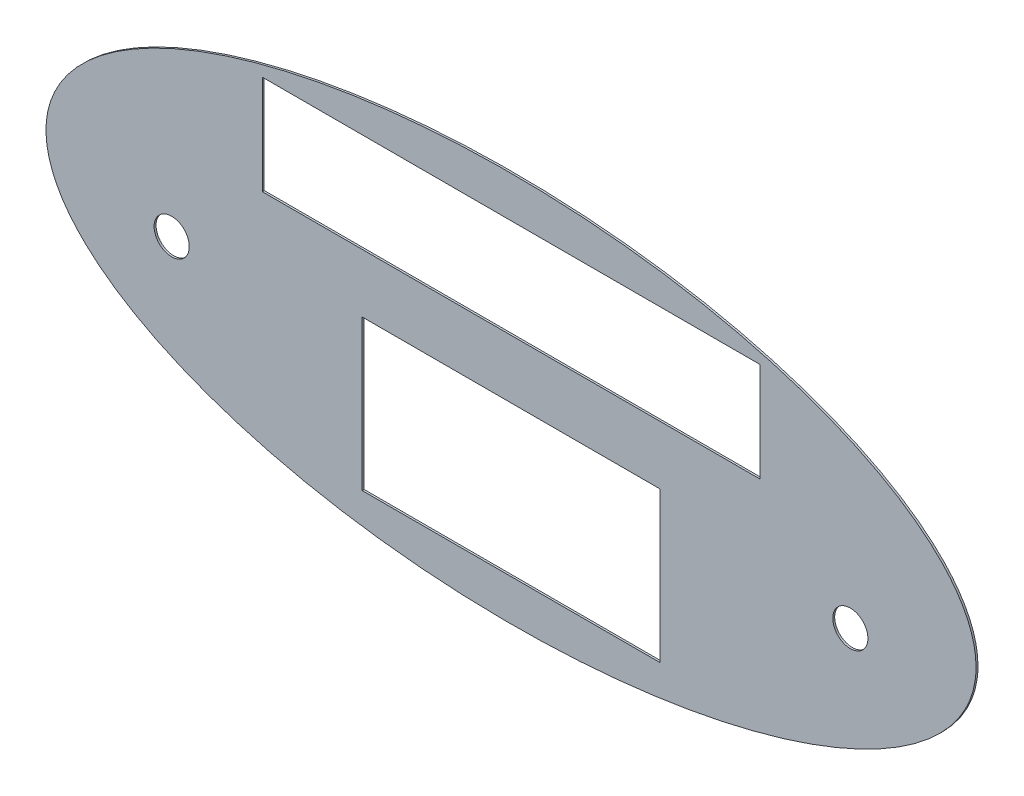
ISO-10303-21;
HEADER;
FILE_DESCRIPTION(('STEP AP214'),'2;1');
FILE_NAME('part.step','',(''),(''),'','','');
FILE_SCHEMA(('AUTOMOTIVE_DESIGN { 1 0 10303 214 1 1 1 1 }'));
ENDSEC;
DATA;
#1=APPLICATION_CONTEXT('core data for automotive mechanical design processes');
#2=APPLICATION_PROTOCOL_DEFINITION('international standard','automotive_design',2000,#1);
#3=PRODUCT_CONTEXT('',#1,'mechanical');
#4=PRODUCT('Part','Part','',(#3));
#5=PRODUCT_RELATED_PRODUCT_CATEGORY('part','',(#4));
#6=PRODUCT_DEFINITION_FORMATION('','',#4);
#7=PRODUCT_DEFINITION_CONTEXT('part definition',#1,'design');
#8=PRODUCT_DEFINITION('design','',#6,#7);
#9=PRODUCT_DEFINITION_SHAPE('','',#8);
#10=(LENGTH_UNIT() NAMED_UNIT(*) SI_UNIT(.MILLI.,.METRE.));
#11=(NAMED_UNIT(*) PLANE_ANGLE_UNIT() SI_UNIT($,.RADIAN.));
#12=(NAMED_UNIT(*) SI_UNIT($,.STERADIAN.) SOLID_ANGLE_UNIT());
#13=UNCERTAINTY_MEASURE_WITH_UNIT(LENGTH_MEASURE(1.E-05),#10,'distance_accuracy_value','');
#14=(GEOMETRIC_REPRESENTATION_CONTEXT(3) GLOBAL_UNCERTAINTY_ASSIGNED_CONTEXT((#13)) GLOBAL_UNIT_ASSIGNED_CONTEXT((#10,
#11,#12)) REPRESENTATION_CONTEXT('',''));
#15=CARTESIAN_POINT('',(0.,0.,0.));
#16=DIRECTION('',(0.,0.,1.));
#17=DIRECTION('',(1.,0.,0.));
#18=AXIS2_PLACEMENT_3D('',#15,#16,#17);
#19=CARTESIAN_POINT('',(0.,1.89999999999999,1.));
#20=DIRECTION('',(0.,0.,1.));
#21=DIRECTION('',(1.,0.,0.));
#22=AXIS2_PLACEMENT_3D('',#19,#20,#21);
#23=PLANE('',#22);
#24=CARTESIAN_POINT('',(173.785,-13.1,1.));
#25=DIRECTION('',(0.,0.,1.));
#26=DIRECTION('',(1.,0.,0.));
#27=AXIS2_PLACEMENT_3D('',#24,#25,#26);
#28=CIRCLE('',#27,9.00000000000001);
#29=CARTESIAN_POINT('',(182.785,-13.1,1.));
#30=VERTEX_POINT('',#29);
#31=EDGE_CURVE('E129',#30,#30,#28,.T.);
#32=ORIENTED_EDGE('',*,*,#31,.F.);
#33=EDGE_LOOP('',(#32));
#34=FACE_BOUND('',#33,.T.);
#35=CARTESIAN_POINT('',(0.,1.89999999999999,1.));
#36=DIRECTION('',(0.,0.,1.));
#37=DIRECTION('',(1.,0.,0.));
#38=AXIS2_PLACEMENT_3D('',#35,#36,#37);
#39=ELLIPSE('',#38,238.17677875,100.);
#40=CARTESIAN_POINT('',(238.17677875,1.90000000000001,1.));
#41=VERTEX_POINT('',#40);
#42=EDGE_CURVE('E11',#41,#41,#39,.T.);
#43=ORIENTED_EDGE('',*,*,#42,.T.);
#44=EDGE_LOOP('',(#43));
#45=FACE_BOUND('',#44,.T.);
#46=DIRECTION('',(1.,0.,0.));
#47=VECTOR('',#46,1.);
#48=CARTESIAN_POINT('',(-127.4,30.,1.));
#49=LINE('',#48,#47);
#50=CARTESIAN_POINT('',(-127.4,30.,1.));
#51=VERTEX_POINT('',#50);
#52=CARTESIAN_POINT('',(127.4,30.,1.));
#53=VERTEX_POINT('',#52);
#54=EDGE_CURVE('E141',#51,#53,#49,.T.);
#55=ORIENTED_EDGE('',*,*,#54,.F.);
#56=DIRECTION('',(0.,-1.,0.));
#57=VECTOR('',#56,1.);
#58=CARTESIAN_POINT('',(-127.4,80.8,1.));
#59=LINE('',#58,#57);
#60=CARTESIAN_POINT('',(-127.4,80.8,1.));
#61=VERTEX_POINT('',#60);
#62=EDGE_CURVE('E139',#61,#51,#59,.T.);
#63=ORIENTED_EDGE('',*,*,#62,.F.);
#64=DIRECTION('',(-1.,0.,0.));
#65=VECTOR('',#64,1.);
#66=CARTESIAN_POINT('',(-127.4,80.8,1.));
#67=LINE('',#66,#65);
#68=CARTESIAN_POINT('',(127.4,80.8,1.));
#69=VERTEX_POINT('',#68);
#70=EDGE_CURVE('E147',#69,#61,#67,.T.);
#71=ORIENTED_EDGE('',*,*,#70,.F.);
#72=DIRECTION('',(0.,1.,0.));
#73=VECTOR('',#72,1.);
#74=CARTESIAN_POINT('',(127.4,80.8,1.));
#75=LINE('',#74,#73);
#76=EDGE_CURVE('E144',#53,#69,#75,.T.);
#77=ORIENTED_EDGE('',*,*,#76,.F.);
#78=EDGE_LOOP('',(#55,#63,#71,#77));
#79=FACE_BOUND('',#78,.T.);
#80=DIRECTION('',(1.,0.,0.));
#81=VECTOR('',#80,1.);
#82=CARTESIAN_POINT('',(-76.2,-77.,1.));
#83=LINE('',#82,#81);
#84=CARTESIAN_POINT('',(-76.2,-77.,1.));
#85=VERTEX_POINT('',#84);
#86=CARTESIAN_POINT('',(76.2,-77.,1.));
#87=VERTEX_POINT('',#86);
#88=EDGE_CURVE('E108',#85,#87,#83,.T.);
#89=ORIENTED_EDGE('',*,*,#88,.F.);
#90=DIRECTION('',(0.,-1.,0.));
#91=VECTOR('',#90,1.);
#92=CARTESIAN_POINT('',(-76.2,0.,1.));
#93=LINE('',#92,#91);
#94=CARTESIAN_POINT('',(-76.2,0.,1.));
#95=VERTEX_POINT('',#94);
#96=EDGE_CURVE('E100',#95,#85,#93,.T.);
#97=ORIENTED_EDGE('',*,*,#96,.F.);
#98=DIRECTION('',(-1.,0.,0.));
#99=VECTOR('',#98,1.);
#100=CARTESIAN_POINT('',(-76.2,0.,1.));
#101=LINE('',#100,#99);
#102=CARTESIAN_POINT('',(76.2,0.,1.));
#103=VERTEX_POINT('',#102);
#104=EDGE_CURVE('E123',#103,#95,#101,.T.);
#105=ORIENTED_EDGE('',*,*,#104,.F.);
#106=DIRECTION('',(0.,1.,0.));
#107=VECTOR('',#106,1.);
#108=CARTESIAN_POINT('',(76.2,0.,1.));
#109=LINE('',#108,#107);
#110=EDGE_CURVE('E121',#87,#103,#109,.T.);
#111=ORIENTED_EDGE('',*,*,#110,.F.);
#112=EDGE_LOOP('',(#89,#97,#105,#111));
#113=FACE_BOUND('',#112,.T.);
#114=CARTESIAN_POINT('',(-173.785,-13.1,1.));
#115=DIRECTION('',(0.,0.,1.));
#116=DIRECTION('',(-1.,0.,0.));
#117=AXIS2_PLACEMENT_3D('',#114,#115,#116);
#118=CIRCLE('',#117,9.00000000000001);
#119=CARTESIAN_POINT('',(-182.785,-13.1,1.));
#120=VERTEX_POINT('',#119);
#121=EDGE_CURVE('E188',#120,#120,#118,.T.);
#122=ORIENTED_EDGE('',*,*,#121,.F.);
#123=EDGE_LOOP('',(#122));
#124=FACE_BOUND('',#123,.T.);
#125=ADVANCED_FACE('F35',(#34,#45,#79,#113,#124),#23,.T.);
#126=CARTESIAN_POINT('',(0.,1.89999999999999,0.));
#127=DIRECTION('',(0.,0.,1.));
#128=DIRECTION('',(1.,0.,0.));
#129=AXIS2_PLACEMENT_3D('',#126,#127,#128);
#130=PLANE('',#129);
#131=DIRECTION('',(0.,-1.,0.));
#132=VECTOR('',#131,1.);
#133=CARTESIAN_POINT('',(-127.4,80.8,0.));
#134=LINE('',#133,#132);
#135=CARTESIAN_POINT('',(-127.4,80.8,0.));
#136=VERTEX_POINT('',#135);
#137=CARTESIAN_POINT('',(-127.4,30.,0.));
#138=VERTEX_POINT('',#137);
#139=EDGE_CURVE('E116',#136,#138,#134,.T.);
#140=ORIENTED_EDGE('',*,*,#139,.T.);
#141=DIRECTION('',(1.,0.,0.));
#142=VECTOR('',#141,1.);
#143=CARTESIAN_POINT('',(-127.4,30.,0.));
#144=LINE('',#143,#142);
#145=CARTESIAN_POINT('',(127.4,30.,0.));
#146=VERTEX_POINT('',#145);
#147=EDGE_CURVE('E152',#138,#146,#144,.T.);
#148=ORIENTED_EDGE('',*,*,#147,.T.);
#149=DIRECTION('',(0.,1.,0.));
#150=VECTOR('',#149,1.);
#151=CARTESIAN_POINT('',(127.4,80.8,0.));
#152=LINE('',#151,#150);
#153=CARTESIAN_POINT('',(127.4,80.8,0.));
#154=VERTEX_POINT('',#153);
#155=EDGE_CURVE('E155',#146,#154,#152,.T.);
#156=ORIENTED_EDGE('',*,*,#155,.T.);
#157=DIRECTION('',(-1.,0.,0.));
#158=VECTOR('',#157,1.);
#159=CARTESIAN_POINT('',(-127.4,80.8,0.));
#160=LINE('',#159,#158);
#161=EDGE_CURVE('E142',#154,#136,#160,.T.);
#162=ORIENTED_EDGE('',*,*,#161,.T.);
#163=EDGE_LOOP('',(#140,#148,#156,#162));
#164=FACE_BOUND('',#163,.T.);
#165=CARTESIAN_POINT('',(0.,1.89999999999999,0.));
#166=DIRECTION('',(0.,0.,1.));
#167=DIRECTION('',(1.,0.,0.));
#168=AXIS2_PLACEMENT_3D('',#165,#166,#167);
#169=ELLIPSE('',#168,238.17677875,100.);
#170=CARTESIAN_POINT('',(238.17677875,1.90000000000001,0.));
#171=VERTEX_POINT('',#170);
#172=EDGE_CURVE('E40',#171,#171,#169,.T.);
#173=ORIENTED_EDGE('',*,*,#172,.F.);
#174=EDGE_LOOP('',(#173));
#175=FACE_BOUND('',#174,.T.);
#176=DIRECTION('',(0.,-1.,0.));
#177=VECTOR('',#176,1.);
#178=CARTESIAN_POINT('',(-76.2,0.,0.));
#179=LINE('',#178,#177);
#180=CARTESIAN_POINT('',(-76.2,0.,0.));
#181=VERTEX_POINT('',#180);
#182=CARTESIAN_POINT('',(-76.2,-77.,0.));
#183=VERTEX_POINT('',#182);
#184=EDGE_CURVE('E58',#181,#183,#179,.T.);
#185=ORIENTED_EDGE('',*,*,#184,.T.);
#186=DIRECTION('',(1.,0.,0.));
#187=VECTOR('',#186,1.);
#188=CARTESIAN_POINT('',(-76.2,-77.,0.));
#189=LINE('',#188,#187);
#190=CARTESIAN_POINT('',(76.2,-77.,0.));
#191=VERTEX_POINT('',#190);
#192=EDGE_CURVE('E115',#183,#191,#189,.T.);
#193=ORIENTED_EDGE('',*,*,#192,.T.);
#194=DIRECTION('',(0.,1.,0.));
#195=VECTOR('',#194,1.);
#196=CARTESIAN_POINT('',(76.2,0.,0.));
#197=LINE('',#196,#195);
#198=CARTESIAN_POINT('',(76.2,0.,0.));
#199=VERTEX_POINT('',#198);
#200=EDGE_CURVE('E131',#191,#199,#197,.T.);
#201=ORIENTED_EDGE('',*,*,#200,.T.);
#202=DIRECTION('',(-1.,0.,0.));
#203=VECTOR('',#202,1.);
#204=CARTESIAN_POINT('',(-76.2,0.,0.));
#205=LINE('',#204,#203);
#206=EDGE_CURVE('E109',#199,#181,#205,.T.);
#207=ORIENTED_EDGE('',*,*,#206,.T.);
#208=EDGE_LOOP('',(#185,#193,#201,#207));
#209=FACE_BOUND('',#208,.T.);
#210=CARTESIAN_POINT('',(173.785,-13.1,0.));
#211=DIRECTION('',(0.,0.,1.));
#212=DIRECTION('',(1.,0.,0.));
#213=AXIS2_PLACEMENT_3D('',#210,#211,#212);
#214=CIRCLE('',#213,9.00000000000001);
#215=CARTESIAN_POINT('',(182.785,-13.1,0.));
#216=VERTEX_POINT('',#215);
#217=EDGE_CURVE('E183',#216,#216,#214,.T.);
#218=ORIENTED_EDGE('',*,*,#217,.T.);
#219=EDGE_LOOP('',(#218));
#220=FACE_BOUND('',#219,.T.);
#221=CARTESIAN_POINT('',(-173.785,-13.1,0.));
#222=DIRECTION('',(0.,0.,1.));
#223=DIRECTION('',(-1.,0.,0.));
#224=AXIS2_PLACEMENT_3D('',#221,#222,#223);
#225=CIRCLE('',#224,9.00000000000001);
#226=CARTESIAN_POINT('',(-182.785,-13.1,0.));
#227=VERTEX_POINT('',#226);
#228=EDGE_CURVE('E186',#227,#227,#225,.T.);
#229=ORIENTED_EDGE('',*,*,#228,.T.);
#230=EDGE_LOOP('',(#229));
#231=FACE_BOUND('',#230,.T.);
#232=ADVANCED_FACE('F175',(#164,#175,#209,#220,#231),#130,.F.);
#233=DIRECTION('',(0.,0.,-1.));
#234=VECTOR('',#233,1.);
#235=SURFACE_OF_LINEAR_EXTRUSION('',#39,#234);
#236=ORIENTED_EDGE('',*,*,#42,.F.);
#237=EDGE_LOOP('',(#236));
#238=FACE_BOUND('',#237,.T.);
#239=ORIENTED_EDGE('',*,*,#172,.T.);
#240=EDGE_LOOP('',(#239));
#241=FACE_BOUND('',#240,.T.);
#242=ADVANCED_FACE('F37',(#238,#241),#235,.F.);
#243=CARTESIAN_POINT('',(-127.4,80.8,1.));
#244=DIRECTION('',(1.,0.,0.));
#245=DIRECTION('',(0.,0.,-1.));
#246=AXIS2_PLACEMENT_3D('',#243,#244,#245);
#247=PLANE('',#246);
#248=ORIENTED_EDGE('',*,*,#139,.F.);
#249=DIRECTION('',(0.,0.,-1.));
#250=VECTOR('',#249,1.);
#251=CARTESIAN_POINT('',(-127.4,80.8,1.));
#252=LINE('',#251,#250);
#253=EDGE_CURVE('E149',#61,#136,#252,.T.);
#254=ORIENTED_EDGE('',*,*,#253,.F.);
#255=ORIENTED_EDGE('',*,*,#62,.T.);
#256=DIRECTION('',(0.,0.,-1.));
#257=VECTOR('',#256,1.);
#258=CARTESIAN_POINT('',(-127.4,30.,1.));
#259=LINE('',#258,#257);
#260=EDGE_CURVE('E166',#51,#138,#259,.T.);
#261=ORIENTED_EDGE('',*,*,#260,.T.);
#262=EDGE_LOOP('',(#248,#254,#255,#261));
#263=FACE_BOUND('',#262,.T.);
#264=ADVANCED_FACE('F216',(#263),#247,.T.);
#265=CARTESIAN_POINT('',(-127.4,30.,1.));
#266=DIRECTION('',(0.,1.,0.));
#267=DIRECTION('',(-1.,0.,0.));
#268=AXIS2_PLACEMENT_3D('',#265,#266,#267);
#269=PLANE('',#268);
#270=ORIENTED_EDGE('',*,*,#147,.F.);
#271=ORIENTED_EDGE('',*,*,#260,.F.);
#272=ORIENTED_EDGE('',*,*,#54,.T.);
#273=DIRECTION('',(0.,0.,-1.));
#274=VECTOR('',#273,1.);
#275=CARTESIAN_POINT('',(127.4,30.,1.));
#276=LINE('',#275,#274);
#277=EDGE_CURVE('E164',#53,#146,#276,.T.);
#278=ORIENTED_EDGE('',*,*,#277,.T.);
#279=EDGE_LOOP('',(#270,#271,#272,#278));
#280=FACE_BOUND('',#279,.T.);
#281=ADVANCED_FACE('F210',(#280),#269,.T.);
#282=CARTESIAN_POINT('',(127.4,80.8,1.));
#283=DIRECTION('',(-1.,0.,0.));
#284=DIRECTION('',(0.,0.,1.));
#285=AXIS2_PLACEMENT_3D('',#282,#283,#284);
#286=PLANE('',#285);
#287=ORIENTED_EDGE('',*,*,#155,.F.);
#288=ORIENTED_EDGE('',*,*,#277,.F.);
#289=ORIENTED_EDGE('',*,*,#76,.T.);
#290=DIRECTION('',(0.,0.,-1.));
#291=VECTOR('',#290,1.);
#292=CARTESIAN_POINT('',(127.4,80.8,1.));
#293=LINE('',#292,#291);
#294=EDGE_CURVE('E162',#69,#154,#293,.T.);
#295=ORIENTED_EDGE('',*,*,#294,.T.);
#296=EDGE_LOOP('',(#287,#288,#289,#295));
#297=FACE_BOUND('',#296,.T.);
#298=ADVANCED_FACE('F213',(#297),#286,.T.);
#299=CARTESIAN_POINT('',(-127.4,80.8,1.));
#300=DIRECTION('',(0.,-1.,0.));
#301=DIRECTION('',(1.,0.,0.));
#302=AXIS2_PLACEMENT_3D('',#299,#300,#301);
#303=PLANE('',#302);
#304=ORIENTED_EDGE('',*,*,#161,.F.);
#305=ORIENTED_EDGE('',*,*,#294,.F.);
#306=ORIENTED_EDGE('',*,*,#70,.T.);
#307=ORIENTED_EDGE('',*,*,#253,.T.);
#308=EDGE_LOOP('',(#304,#305,#306,#307));
#309=FACE_BOUND('',#308,.T.);
#310=ADVANCED_FACE('F218',(#309),#303,.T.);
#311=CARTESIAN_POINT('',(-76.2,0.,1.));
#312=DIRECTION('',(1.,0.,0.));
#313=DIRECTION('',(0.,0.,-1.));
#314=AXIS2_PLACEMENT_3D('',#311,#312,#313);
#315=PLANE('',#314);
#316=ORIENTED_EDGE('',*,*,#184,.F.);
#317=DIRECTION('',(0.,0.,-1.));
#318=VECTOR('',#317,1.);
#319=CARTESIAN_POINT('',(-76.2,0.,1.));
#320=LINE('',#319,#318);
#321=EDGE_CURVE('E104',#95,#181,#320,.T.);
#322=ORIENTED_EDGE('',*,*,#321,.F.);
#323=ORIENTED_EDGE('',*,*,#96,.T.);
#324=DIRECTION('',(0.,0.,-1.));
#325=VECTOR('',#324,1.);
#326=CARTESIAN_POINT('',(-76.2,-77.,1.));
#327=LINE('',#326,#325);
#328=EDGE_CURVE('E103',#85,#183,#327,.T.);
#329=ORIENTED_EDGE('',*,*,#328,.T.);
#330=EDGE_LOOP('',(#316,#322,#323,#329));
#331=FACE_BOUND('',#330,.T.);
#332=ADVANCED_FACE('F102',(#331),#315,.T.);
#333=CARTESIAN_POINT('',(-76.2,-77.,1.));
#334=DIRECTION('',(0.,1.,0.));
#335=DIRECTION('',(0.,0.,1.));
#336=AXIS2_PLACEMENT_3D('',#333,#334,#335);
#337=PLANE('',#336);
#338=ORIENTED_EDGE('',*,*,#192,.F.);
#339=ORIENTED_EDGE('',*,*,#328,.F.);
#340=ORIENTED_EDGE('',*,*,#88,.T.);
#341=DIRECTION('',(0.,0.,-1.));
#342=VECTOR('',#341,1.);
#343=CARTESIAN_POINT('',(76.2,-77.,1.));
#344=LINE('',#343,#342);
#345=EDGE_CURVE('E117',#87,#191,#344,.T.);
#346=ORIENTED_EDGE('',*,*,#345,.T.);
#347=EDGE_LOOP('',(#338,#339,#340,#346));
#348=FACE_BOUND('',#347,.T.);
#349=ADVANCED_FACE('F112',(#348),#337,.T.);
#350=CARTESIAN_POINT('',(76.2,0.,1.));
#351=DIRECTION('',(-1.,0.,0.));
#352=DIRECTION('',(0.,0.,1.));
#353=AXIS2_PLACEMENT_3D('',#350,#351,#352);
#354=PLANE('',#353);
#355=ORIENTED_EDGE('',*,*,#200,.F.);
#356=ORIENTED_EDGE('',*,*,#345,.F.);
#357=ORIENTED_EDGE('',*,*,#110,.T.);
#358=DIRECTION('',(0.,0.,-1.));
#359=VECTOR('',#358,1.);
#360=CARTESIAN_POINT('',(76.2,0.,1.));
#361=LINE('',#360,#359);
#362=EDGE_CURVE('E50',#103,#199,#361,.T.);
#363=ORIENTED_EDGE('',*,*,#362,.T.);
#364=EDGE_LOOP('',(#355,#356,#357,#363));
#365=FACE_BOUND('',#364,.T.);
#366=ADVANCED_FACE('F283',(#365),#354,.T.);
#367=CARTESIAN_POINT('',(-76.2,0.,1.));
#368=DIRECTION('',(0.,-1.,0.));
#369=DIRECTION('',(0.,0.,-1.));
#370=AXIS2_PLACEMENT_3D('',#367,#368,#369);
#371=PLANE('',#370);
#372=ORIENTED_EDGE('',*,*,#206,.F.);
#373=ORIENTED_EDGE('',*,*,#362,.F.);
#374=ORIENTED_EDGE('',*,*,#104,.T.);
#375=ORIENTED_EDGE('',*,*,#321,.T.);
#376=EDGE_LOOP('',(#372,#373,#374,#375));
#377=FACE_BOUND('',#376,.T.);
#378=ADVANCED_FACE('F290',(#377),#371,.T.);
#379=CARTESIAN_POINT('',(173.785,-13.1,1.));
#380=DIRECTION('',(0.,0.,-1.));
#381=DIRECTION('',(-1.,0.,0.));
#382=AXIS2_PLACEMENT_3D('',#379,#380,#381);
#383=CYLINDRICAL_SURFACE('',#382,9.00000000000001);
#384=ORIENTED_EDGE('',*,*,#31,.T.);
#385=EDGE_LOOP('',(#384));
#386=FACE_BOUND('',#385,.T.);
#387=ORIENTED_EDGE('',*,*,#217,.F.);
#388=EDGE_LOOP('',(#387));
#389=FACE_BOUND('',#388,.T.);
#390=ADVANCED_FACE('F196',(#386,#389),#383,.F.);
#391=CARTESIAN_POINT('',(-173.785,-13.1,1.));
#392=DIRECTION('',(0.,0.,-1.));
#393=DIRECTION('',(-1.,0.,0.));
#394=AXIS2_PLACEMENT_3D('',#391,#392,#393);
#395=CYLINDRICAL_SURFACE('',#394,9.00000000000001);
#396=ORIENTED_EDGE('',*,*,#121,.T.);
#397=EDGE_LOOP('',(#396));
#398=FACE_BOUND('',#397,.T.);
#399=ORIENTED_EDGE('',*,*,#228,.F.);
#400=EDGE_LOOP('',(#399));
#401=FACE_BOUND('',#400,.T.);
#402=ADVANCED_FACE('F306',(#398,#401),#395,.F.);
#403=CLOSED_SHELL('',(#125,#232,#242,#264,#281,#298,#310,#332,#349,#366,#378,#390,#402));
#404=MANIFOLD_SOLID_BREP('B2',#403);
#405=ADVANCED_BREP_SHAPE_REPRESENTATION('',(#18,#404),#14);
#406=SHAPE_DEFINITION_REPRESENTATION(#9,#405);
ENDSEC;
END-ISO-10303-21;
